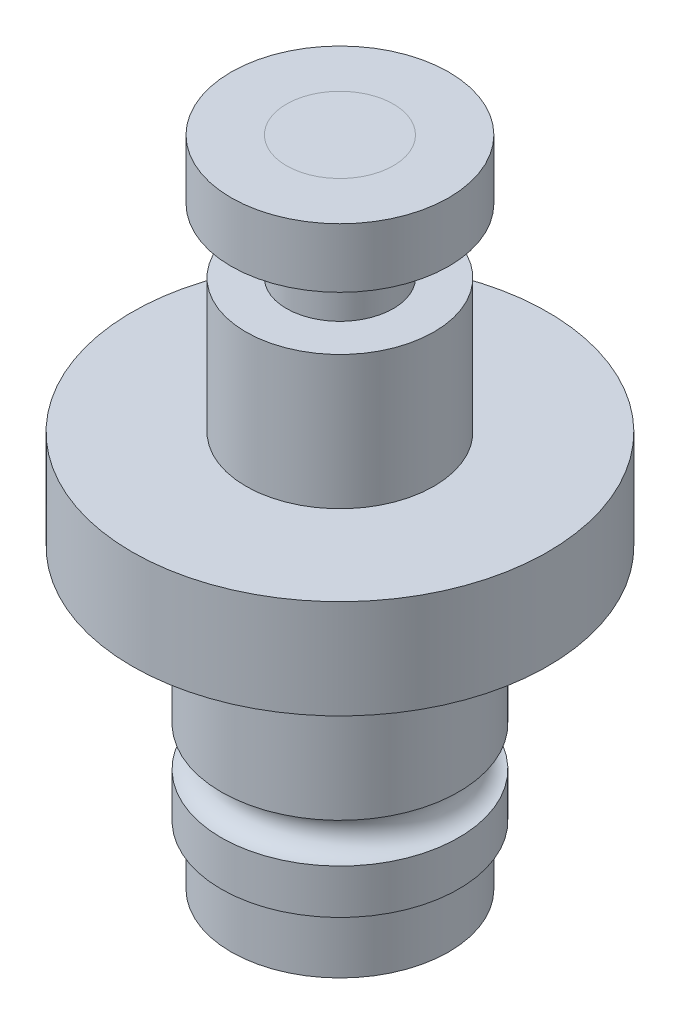
ISO-10303-21;
HEADER;
FILE_DESCRIPTION(('STEP AP214'),'2;1');
FILE_NAME('part.step','',(''),(''),'','','');
FILE_SCHEMA(('AUTOMOTIVE_DESIGN { 1 0 10303 214 1 1 1 1 }'));
ENDSEC;
DATA;
#1=APPLICATION_CONTEXT('core data for automotive mechanical design processes');
#2=APPLICATION_PROTOCOL_DEFINITION('international standard','automotive_design',2000,#1);
#3=PRODUCT_CONTEXT('',#1,'mechanical');
#4=PRODUCT('Part','Part','',(#3));
#5=PRODUCT_RELATED_PRODUCT_CATEGORY('part','',(#4));
#6=PRODUCT_DEFINITION_FORMATION('','',#4);
#7=PRODUCT_DEFINITION_CONTEXT('part definition',#1,'design');
#8=PRODUCT_DEFINITION('design','',#6,#7);
#9=PRODUCT_DEFINITION_SHAPE('','',#8);
#10=(LENGTH_UNIT() NAMED_UNIT(*) SI_UNIT(.MILLI.,.METRE.));
#11=(NAMED_UNIT(*) PLANE_ANGLE_UNIT() SI_UNIT($,.RADIAN.));
#12=(NAMED_UNIT(*) SI_UNIT($,.STERADIAN.) SOLID_ANGLE_UNIT());
#13=UNCERTAINTY_MEASURE_WITH_UNIT(LENGTH_MEASURE(1.E-05),#10,'distance_accuracy_value','');
#14=(GEOMETRIC_REPRESENTATION_CONTEXT(3) GLOBAL_UNCERTAINTY_ASSIGNED_CONTEXT((#13)) GLOBAL_UNIT_ASSIGNED_CONTEXT((#10,
#11,#12)) REPRESENTATION_CONTEXT('',''));
#15=CARTESIAN_POINT('',(0.,0.,0.));
#16=DIRECTION('',(0.,0.,1.));
#17=DIRECTION('',(1.,0.,0.));
#18=AXIS2_PLACEMENT_3D('',#15,#16,#17);
#19=CARTESIAN_POINT('',(0.,-17.5,0.));
#20=DIRECTION('',(0.,-1.,0.));
#21=DIRECTION('',(0.,0.,-1.));
#22=AXIS2_PLACEMENT_3D('',#19,#20,#21);
#23=PLANE('',#22);
#24=CARTESIAN_POINT('',(0.,-17.5,0.));
#25=DIRECTION('',(0.,-1.,0.));
#26=DIRECTION('',(0.,0.,-1.));
#27=AXIS2_PLACEMENT_3D('',#24,#25,#26);
#28=CIRCLE('',#27,5.5);
#29=CARTESIAN_POINT('',(0.,-17.5,-5.5));
#30=VERTEX_POINT('',#29);
#31=EDGE_CURVE('E11',#30,#30,#28,.T.);
#32=ORIENTED_EDGE('',*,*,#31,.T.);
#33=EDGE_LOOP('',(#32));
#34=FACE_BOUND('',#33,.T.);
#35=CARTESIAN_POINT('',(0.,-17.5,0.));
#36=DIRECTION('',(0.,-1.,0.));
#37=DIRECTION('',(0.,0.,-1.));
#38=AXIS2_PLACEMENT_3D('',#35,#36,#37);
#39=CIRCLE('',#38,2.5);
#40=CARTESIAN_POINT('',(0.,-17.5,-2.5));
#41=VERTEX_POINT('',#40);
#42=EDGE_CURVE('E52',#41,#41,#39,.T.);
#43=ORIENTED_EDGE('',*,*,#42,.F.);
#44=EDGE_LOOP('',(#43));
#45=FACE_BOUND('',#44,.T.);
#46=ADVANCED_FACE('F41',(#34,#45),#23,.T.);
#47=CARTESIAN_POINT('',(0.,-14.5,0.));
#48=DIRECTION('',(0.,-1.,0.));
#49=DIRECTION('',(0.,0.,-1.));
#50=AXIS2_PLACEMENT_3D('',#47,#48,#49);
#51=PLANE('',#50);
#52=CARTESIAN_POINT('',(0.,-14.5,0.));
#53=DIRECTION('',(0.,-1.,0.));
#54=DIRECTION('',(0.,0.,-1.));
#55=AXIS2_PLACEMENT_3D('',#52,#53,#54);
#56=CIRCLE('',#55,5.5);
#57=CARTESIAN_POINT('',(0.,-14.5,-5.5));
#58=VERTEX_POINT('',#57);
#59=EDGE_CURVE('E45',#58,#58,#56,.T.);
#60=ORIENTED_EDGE('',*,*,#59,.F.);
#61=EDGE_LOOP('',(#60));
#62=FACE_BOUND('',#61,.T.);
#63=CARTESIAN_POINT('',(0.,-14.5,0.));
#64=DIRECTION('',(0.,-1.,0.));
#65=DIRECTION('',(0.,0.,-1.));
#66=AXIS2_PLACEMENT_3D('',#63,#64,#65);
#67=CIRCLE('',#66,2.5);
#68=CARTESIAN_POINT('',(0.,-14.5,-2.5));
#69=VERTEX_POINT('',#68);
#70=EDGE_CURVE('E54',#69,#69,#67,.T.);
#71=ORIENTED_EDGE('',*,*,#70,.T.);
#72=EDGE_LOOP('',(#71));
#73=FACE_BOUND('',#72,.T.);
#74=ADVANCED_FACE('F64',(#62,#73),#51,.F.);
#75=CARTESIAN_POINT('',(0.,-17.5,0.));
#76=DIRECTION('',(0.,1.,0.));
#77=DIRECTION('',(0.,0.,1.));
#78=AXIS2_PLACEMENT_3D('',#75,#76,#77);
#79=CYLINDRICAL_SURFACE('',#78,5.5);
#80=ORIENTED_EDGE('',*,*,#31,.F.);
#81=EDGE_LOOP('',(#80));
#82=FACE_BOUND('',#81,.T.);
#83=ORIENTED_EDGE('',*,*,#59,.T.);
#84=EDGE_LOOP('',(#83));
#85=FACE_BOUND('',#84,.T.);
#86=ADVANCED_FACE('F43',(#82,#85),#79,.T.);
#87=CARTESIAN_POINT('',(0.,-17.5,0.));
#88=DIRECTION('',(0.,1.,0.));
#89=DIRECTION('',(0.,0.,1.));
#90=AXIS2_PLACEMENT_3D('',#87,#88,#89);
#91=CYLINDRICAL_SURFACE('',#90,2.5);
#92=ORIENTED_EDGE('',*,*,#42,.T.);
#93=EDGE_LOOP('',(#92));
#94=FACE_BOUND('',#93,.T.);
#95=ORIENTED_EDGE('',*,*,#70,.F.);
#96=EDGE_LOOP('',(#95));
#97=FACE_BOUND('',#96,.T.);
#98=ADVANCED_FACE('F60',(#94,#97),#91,.F.);
#99=CLOSED_SHELL('',(#46,#74,#86,#98));
#100=MANIFOLD_SOLID_BREP('B2',#99);
#101=CARTESIAN_POINT('',(0.,-14.5,0.));
#102=DIRECTION('',(0.,1.,0.));
#103=DIRECTION('',(0.,0.,1.));
#104=AXIS2_PLACEMENT_3D('',#101,#102,#103);
#105=CYLINDRICAL_SURFACE('',#104,6.);
#106=CARTESIAN_POINT('',(0.,-12.25,0.));
#107=DIRECTION('',(0.,1.,0.));
#108=DIRECTION('',(0.,0.,1.));
#109=AXIS2_PLACEMENT_3D('',#106,#107,#108);
#110=CIRCLE('',#109,6.);
#111=CARTESIAN_POINT('',(0.,-12.25,6.));
#112=VERTEX_POINT('',#111);
#113=EDGE_CURVE('E114',#112,#112,#110,.F.);
#114=ORIENTED_EDGE('',*,*,#113,.T.);
#115=EDGE_LOOP('',(#114));
#116=FACE_BOUND('',#115,.T.);
#117=CARTESIAN_POINT('',(0.,-14.5,0.));
#118=DIRECTION('',(0.,-1.,0.));
#119=DIRECTION('',(0.,0.,-1.));
#120=AXIS2_PLACEMENT_3D('',#117,#118,#119);
#121=CIRCLE('',#120,6.);
#122=CARTESIAN_POINT('',(0.,-14.5,-6.));
#123=VERTEX_POINT('',#122);
#124=EDGE_CURVE('E40',#123,#123,#121,.T.);
#125=ORIENTED_EDGE('',*,*,#124,.F.);
#126=EDGE_LOOP('',(#125));
#127=FACE_BOUND('',#126,.T.);
#128=ADVANCED_FACE('F110',(#116,#127),#105,.T.);
#129=CARTESIAN_POINT('',(0.,-14.5,0.));
#130=DIRECTION('',(0.,-1.,0.));
#131=DIRECTION('',(0.,0.,-1.));
#132=AXIS2_PLACEMENT_3D('',#129,#130,#131);
#133=PLANE('',#132);
#134=ORIENTED_EDGE('',*,*,#124,.T.);
#135=EDGE_LOOP('',(#134));
#136=FACE_BOUND('',#135,.T.);
#137=CARTESIAN_POINT('',(0.,-14.5,0.));
#138=DIRECTION('',(0.,-1.,0.));
#139=DIRECTION('',(0.,0.,-1.));
#140=AXIS2_PLACEMENT_3D('',#137,#138,#139);
#141=CIRCLE('',#140,2.5);
#142=CARTESIAN_POINT('',(0.,-14.5,-2.5));
#143=VERTEX_POINT('',#142);
#144=EDGE_CURVE('E123',#143,#143,#141,.T.);
#145=ORIENTED_EDGE('',*,*,#144,.F.);
#146=EDGE_LOOP('',(#145));
#147=FACE_BOUND('',#146,.T.);
#148=ADVANCED_FACE('F144',(#136,#147),#133,.T.);
#149=CARTESIAN_POINT('',(0.,-3.5,0.));
#150=DIRECTION('',(0.,-1.,0.));
#151=DIRECTION('',(0.,0.,-1.));
#152=AXIS2_PLACEMENT_3D('',#149,#150,#151);
#153=PLANE('',#152);
#154=CARTESIAN_POINT('',(0.,-3.5,0.));
#155=DIRECTION('',(0.,-1.,0.));
#156=DIRECTION('',(0.,0.,-1.));
#157=AXIS2_PLACEMENT_3D('',#154,#155,#156);
#158=CIRCLE('',#157,6.);
#159=CARTESIAN_POINT('',(0.,-3.5,-6.));
#160=VERTEX_POINT('',#159);
#161=EDGE_CURVE('E118',#160,#160,#158,.T.);
#162=ORIENTED_EDGE('',*,*,#161,.F.);
#163=EDGE_LOOP('',(#162));
#164=FACE_BOUND('',#163,.T.);
#165=CARTESIAN_POINT('',(0.,-3.5,0.));
#166=DIRECTION('',(0.,-1.,0.));
#167=DIRECTION('',(0.,0.,-1.));
#168=AXIS2_PLACEMENT_3D('',#165,#166,#167);
#169=CIRCLE('',#168,2.5);
#170=CARTESIAN_POINT('',(0.,-3.5,-2.5));
#171=VERTEX_POINT('',#170);
#172=EDGE_CURVE('E126',#171,#171,#169,.T.);
#173=ORIENTED_EDGE('',*,*,#172,.T.);
#174=EDGE_LOOP('',(#173));
#175=FACE_BOUND('',#174,.T.);
#176=ADVANCED_FACE('F146',(#164,#175),#153,.F.);
#177=CARTESIAN_POINT('',(0.,-10.25,0.));
#178=DIRECTION('',(0.,-1.,0.));
#179=DIRECTION('',(0.,0.,-1.));
#180=AXIS2_PLACEMENT_3D('',#177,#178,#179);
#181=CIRCLE('',#180,6.);
#182=CARTESIAN_POINT('',(0.,-10.25,-6.));
#183=VERTEX_POINT('',#182);
#184=EDGE_CURVE('E128',#183,#183,#181,.F.);
#185=ORIENTED_EDGE('',*,*,#184,.T.);
#186=EDGE_LOOP('',(#185));
#187=FACE_BOUND('',#186,.T.);
#188=ORIENTED_EDGE('',*,*,#161,.T.);
#189=EDGE_LOOP('',(#188));
#190=FACE_BOUND('',#189,.T.);
#191=ADVANCED_FACE('F112',(#187,#190),#105,.T.);
#192=CARTESIAN_POINT('',(0.,-14.5,0.));
#193=DIRECTION('',(0.,1.,0.));
#194=DIRECTION('',(0.,0.,1.));
#195=AXIS2_PLACEMENT_3D('',#192,#193,#194);
#196=CYLINDRICAL_SURFACE('',#195,2.5);
#197=ORIENTED_EDGE('',*,*,#144,.T.);
#198=EDGE_LOOP('',(#197));
#199=FACE_BOUND('',#198,.T.);
#200=ORIENTED_EDGE('',*,*,#172,.F.);
#201=EDGE_LOOP('',(#200));
#202=FACE_BOUND('',#201,.T.);
#203=ADVANCED_FACE('F141',(#199,#202),#196,.F.);
#204=CARTESIAN_POINT('',(0.,-11.25,0.));
#205=DIRECTION('',(0.,-1.,0.));
#206=DIRECTION('',(0.,0.,-1.));
#207=AXIS2_PLACEMENT_3D('',#204,#205,#206);
#208=TOROIDAL_SURFACE('',#207,6.,1.);
#209=ORIENTED_EDGE('',*,*,#184,.F.);
#210=EDGE_LOOP('',(#209));
#211=FACE_BOUND('',#210,.T.);
#212=ORIENTED_EDGE('',*,*,#113,.F.);
#213=EDGE_LOOP('',(#212));
#214=FACE_BOUND('',#213,.T.);
#215=ADVANCED_FACE('F156',(#211,#214),#208,.F.);
#216=CLOSED_SHELL('',(#128,#148,#176,#191,#203,#215));
#217=MANIFOLD_SOLID_BREP('B6',#216);
#218=CARTESIAN_POINT('',(0.,-3.5,0.));
#219=DIRECTION('',(0.,-1.,0.));
#220=DIRECTION('',(0.,0.,-1.));
#221=AXIS2_PLACEMENT_3D('',#218,#219,#220);
#222=PLANE('',#221);
#223=CARTESIAN_POINT('',(0.,-3.5,0.));
#224=DIRECTION('',(0.,-1.,0.));
#225=DIRECTION('',(0.,0.,-1.));
#226=AXIS2_PLACEMENT_3D('',#223,#224,#225);
#227=CIRCLE('',#226,4.875);
#228=CARTESIAN_POINT('',(0.,-3.5,-4.875));
#229=VERTEX_POINT('',#228);
#230=EDGE_CURVE('E109',#229,#229,#227,.T.);
#231=ORIENTED_EDGE('',*,*,#230,.T.);
#232=EDGE_LOOP('',(#231));
#233=FACE_BOUND('',#232,.T.);
#234=CARTESIAN_POINT('',(0.,-3.5,0.));
#235=DIRECTION('',(0.,-1.,0.));
#236=DIRECTION('',(0.,0.,-1.));
#237=AXIS2_PLACEMENT_3D('',#234,#235,#236);
#238=CIRCLE('',#237,2.5);
#239=CARTESIAN_POINT('',(0.,-3.5,-2.5));
#240=VERTEX_POINT('',#239);
#241=EDGE_CURVE('E238',#240,#240,#238,.T.);
#242=ORIENTED_EDGE('',*,*,#241,.F.);
#243=EDGE_LOOP('',(#242));
#244=FACE_BOUND('',#243,.T.);
#245=ADVANCED_FACE('F227',(#233,#244),#222,.T.);
#246=CARTESIAN_POINT('',(0.,-2.5,0.));
#247=DIRECTION('',(0.,-1.,0.));
#248=DIRECTION('',(0.,0.,-1.));
#249=AXIS2_PLACEMENT_3D('',#246,#247,#248);
#250=PLANE('',#249);
#251=CARTESIAN_POINT('',(0.,-2.5,0.));
#252=DIRECTION('',(0.,-1.,0.));
#253=DIRECTION('',(0.,0.,-1.));
#254=AXIS2_PLACEMENT_3D('',#251,#252,#253);
#255=CIRCLE('',#254,4.875);
#256=CARTESIAN_POINT('',(0.,-2.5,-4.875));
#257=VERTEX_POINT('',#256);
#258=EDGE_CURVE('E231',#257,#257,#255,.T.);
#259=ORIENTED_EDGE('',*,*,#258,.F.);
#260=EDGE_LOOP('',(#259));
#261=FACE_BOUND('',#260,.T.);
#262=CARTESIAN_POINT('',(0.,-2.5,0.));
#263=DIRECTION('',(0.,-1.,0.));
#264=DIRECTION('',(0.,0.,-1.));
#265=AXIS2_PLACEMENT_3D('',#262,#263,#264);
#266=CIRCLE('',#265,2.5);
#267=CARTESIAN_POINT('',(0.,-2.5,-2.5));
#268=VERTEX_POINT('',#267);
#269=EDGE_CURVE('E240',#268,#268,#266,.T.);
#270=ORIENTED_EDGE('',*,*,#269,.T.);
#271=EDGE_LOOP('',(#270));
#272=FACE_BOUND('',#271,.T.);
#273=ADVANCED_FACE('F250',(#261,#272),#250,.F.);
#274=CARTESIAN_POINT('',(0.,-3.5,0.));
#275=DIRECTION('',(0.,1.,0.));
#276=DIRECTION('',(0.,0.,1.));
#277=AXIS2_PLACEMENT_3D('',#274,#275,#276);
#278=CYLINDRICAL_SURFACE('',#277,4.875);
#279=ORIENTED_EDGE('',*,*,#230,.F.);
#280=EDGE_LOOP('',(#279));
#281=FACE_BOUND('',#280,.T.);
#282=ORIENTED_EDGE('',*,*,#258,.T.);
#283=EDGE_LOOP('',(#282));
#284=FACE_BOUND('',#283,.T.);
#285=ADVANCED_FACE('F229',(#281,#284),#278,.T.);
#286=CARTESIAN_POINT('',(0.,-3.5,0.));
#287=DIRECTION('',(0.,1.,0.));
#288=DIRECTION('',(0.,0.,1.));
#289=AXIS2_PLACEMENT_3D('',#286,#287,#288);
#290=CYLINDRICAL_SURFACE('',#289,2.5);
#291=ORIENTED_EDGE('',*,*,#241,.T.);
#292=EDGE_LOOP('',(#291));
#293=FACE_BOUND('',#292,.T.);
#294=ORIENTED_EDGE('',*,*,#269,.F.);
#295=EDGE_LOOP('',(#294));
#296=FACE_BOUND('',#295,.T.);
#297=ADVANCED_FACE('F246',(#293,#296),#290,.F.);
#298=CLOSED_SHELL('',(#245,#273,#285,#297));
#299=MANIFOLD_SOLID_BREP('B35',#298);
#300=CARTESIAN_POINT('',(0.,-17.5,0.));
#301=DIRECTION('',(0.,1.,0.));
#302=DIRECTION('',(0.,0.,1.));
#303=AXIS2_PLACEMENT_3D('',#300,#301,#302);
#304=CYLINDRICAL_SURFACE('',#303,2.5);
#305=CARTESIAN_POINT('',(0.,-17.5,0.));
#306=DIRECTION('',(0.,-1.,0.));
#307=DIRECTION('',(0.,0.,-1.));
#308=AXIS2_PLACEMENT_3D('',#305,#306,#307);
#309=CIRCLE('',#308,2.5);
#310=CARTESIAN_POINT('',(0.,-17.5,-2.5));
#311=VERTEX_POINT('',#310);
#312=EDGE_CURVE('E226',#311,#311,#309,.T.);
#313=ORIENTED_EDGE('',*,*,#312,.F.);
#314=EDGE_LOOP('',(#313));
#315=FACE_BOUND('',#314,.T.);
#316=CARTESIAN_POINT('',(0.,-2.5,0.));
#317=DIRECTION('',(0.,-1.,0.));
#318=DIRECTION('',(0.,0.,-1.));
#319=AXIS2_PLACEMENT_3D('',#316,#317,#318);
#320=CIRCLE('',#319,2.5);
#321=CARTESIAN_POINT('',(0.,-2.5,-2.5));
#322=VERTEX_POINT('',#321);
#323=EDGE_CURVE('E312',#322,#322,#320,.T.);
#324=ORIENTED_EDGE('',*,*,#323,.T.);
#325=EDGE_LOOP('',(#324));
#326=FACE_BOUND('',#325,.T.);
#327=ADVANCED_FACE('F309',(#315,#326),#304,.T.);
#328=CARTESIAN_POINT('',(0.,-17.5,0.));
#329=DIRECTION('',(0.,-1.,0.));
#330=DIRECTION('',(0.,0.,-1.));
#331=AXIS2_PLACEMENT_3D('',#328,#329,#330);
#332=PLANE('',#331);
#333=ORIENTED_EDGE('',*,*,#312,.T.);
#334=EDGE_LOOP('',(#333));
#335=FACE_BOUND('',#334,.T.);
#336=ADVANCED_FACE('F324',(#335),#332,.T.);
#337=CARTESIAN_POINT('',(0.,-2.5,0.));
#338=DIRECTION('',(0.,-1.,0.));
#339=DIRECTION('',(0.,0.,-1.));
#340=AXIS2_PLACEMENT_3D('',#337,#338,#339);
#341=PLANE('',#340);
#342=ORIENTED_EDGE('',*,*,#323,.F.);
#343=EDGE_LOOP('',(#342));
#344=FACE_BOUND('',#343,.T.);
#345=ADVANCED_FACE('F322',(#344),#341,.F.);
#346=CLOSED_SHELL('',(#327,#336,#345));
#347=MANIFOLD_SOLID_BREP('B104',#346);
#348=CARTESIAN_POINT('',(0.,12.5,0.));
#349=DIRECTION('',(0.,1.,0.));
#350=DIRECTION('',(0.,0.,1.));
#351=AXIS2_PLACEMENT_3D('',#348,#349,#350);
#352=CYLINDRICAL_SURFACE('',#351,5.5);
#353=CARTESIAN_POINT('',(0.,12.5,0.));
#354=DIRECTION('',(0.,1.,0.));
#355=DIRECTION('',(0.,0.,1.));
#356=AXIS2_PLACEMENT_3D('',#353,#354,#355);
#357=CIRCLE('',#356,5.5);
#358=CARTESIAN_POINT('',(0.,12.5,5.5));
#359=VERTEX_POINT('',#358);
#360=EDGE_CURVE('E308',#359,#359,#357,.T.);
#361=ORIENTED_EDGE('',*,*,#360,.T.);
#362=EDGE_LOOP('',(#361));
#363=FACE_BOUND('',#362,.T.);
#364=CARTESIAN_POINT('',(0.,15.5,0.));
#365=DIRECTION('',(0.,1.,0.));
#366=DIRECTION('',(0.,0.,1.));
#367=AXIS2_PLACEMENT_3D('',#364,#365,#366);
#368=CIRCLE('',#367,5.5);
#369=CARTESIAN_POINT('',(0.,15.5,5.5));
#370=VERTEX_POINT('',#369);
#371=EDGE_CURVE('E372',#370,#370,#368,.T.);
#372=ORIENTED_EDGE('',*,*,#371,.F.);
#373=EDGE_LOOP('',(#372));
#374=FACE_BOUND('',#373,.T.);
#375=ADVANCED_FACE('F369',(#363,#374),#352,.T.);
#376=CARTESIAN_POINT('',(0.,12.5,0.));
#377=DIRECTION('',(0.,1.,0.));
#378=DIRECTION('',(0.,0.,1.));
#379=AXIS2_PLACEMENT_3D('',#376,#377,#378);
#380=PLANE('',#379);
#381=CARTESIAN_POINT('',(0.,12.5,0.));
#382=DIRECTION('',(0.,1.,0.));
#383=DIRECTION('',(0.,0.,1.));
#384=AXIS2_PLACEMENT_3D('',#381,#382,#383);
#385=CIRCLE('',#384,2.7);
#386=CARTESIAN_POINT('',(0.,12.5,2.7));
#387=VERTEX_POINT('',#386);
#388=EDGE_CURVE('E379',#387,#387,#385,.T.);
#389=ORIENTED_EDGE('',*,*,#388,.T.);
#390=EDGE_LOOP('',(#389));
#391=FACE_BOUND('',#390,.T.);
#392=ORIENTED_EDGE('',*,*,#360,.F.);
#393=EDGE_LOOP('',(#392));
#394=FACE_BOUND('',#393,.T.);
#395=ADVANCED_FACE('F387',(#391,#394),#380,.F.);
#396=CARTESIAN_POINT('',(0.,15.5,0.));
#397=DIRECTION('',(0.,1.,0.));
#398=DIRECTION('',(0.,0.,1.));
#399=AXIS2_PLACEMENT_3D('',#396,#397,#398);
#400=PLANE('',#399);
#401=CARTESIAN_POINT('',(0.,15.5,0.));
#402=DIRECTION('',(0.,1.,0.));
#403=DIRECTION('',(0.,0.,1.));
#404=AXIS2_PLACEMENT_3D('',#401,#402,#403);
#405=CIRCLE('',#404,2.7);
#406=CARTESIAN_POINT('',(0.,15.5,2.7));
#407=VERTEX_POINT('',#406);
#408=EDGE_CURVE('E381',#407,#407,#405,.T.);
#409=ORIENTED_EDGE('',*,*,#408,.F.);
#410=EDGE_LOOP('',(#409));
#411=FACE_BOUND('',#410,.T.);
#412=ORIENTED_EDGE('',*,*,#371,.T.);
#413=EDGE_LOOP('',(#412));
#414=FACE_BOUND('',#413,.T.);
#415=ADVANCED_FACE('F393',(#411,#414),#400,.T.);
#416=CARTESIAN_POINT('',(0.,12.5,0.));
#417=DIRECTION('',(0.,1.,0.));
#418=DIRECTION('',(0.,0.,1.));
#419=AXIS2_PLACEMENT_3D('',#416,#417,#418);
#420=CYLINDRICAL_SURFACE('',#419,2.7);
#421=ORIENTED_EDGE('',*,*,#388,.F.);
#422=EDGE_LOOP('',(#421));
#423=FACE_BOUND('',#422,.T.);
#424=ORIENTED_EDGE('',*,*,#408,.T.);
#425=EDGE_LOOP('',(#424));
#426=FACE_BOUND('',#425,.T.);
#427=ADVANCED_FACE('F390',(#423,#426),#420,.F.);
#428=CLOSED_SHELL('',(#375,#395,#415,#427));
#429=MANIFOLD_SOLID_BREP('B221',#428);
#430=CARTESIAN_POINT('',(0.,-2.5,0.));
#431=DIRECTION('',(0.,1.,0.));
#432=DIRECTION('',(0.,0.,1.));
#433=AXIS2_PLACEMENT_3D('',#430,#431,#432);
#434=CYLINDRICAL_SURFACE('',#433,10.5);
#435=CARTESIAN_POINT('',(0.,-2.5,0.));
#436=DIRECTION('',(0.,1.,0.));
#437=DIRECTION('',(0.,0.,1.));
#438=AXIS2_PLACEMENT_3D('',#435,#436,#437);
#439=CIRCLE('',#438,10.5);
#440=CARTESIAN_POINT('',(0.,-2.5,10.5));
#441=VERTEX_POINT('',#440);
#442=EDGE_CURVE('E368',#441,#441,#439,.T.);
#443=ORIENTED_EDGE('',*,*,#442,.T.);
#444=EDGE_LOOP('',(#443));
#445=FACE_BOUND('',#444,.T.);
#446=CARTESIAN_POINT('',(0.,2.5,0.));
#447=DIRECTION('',(0.,1.,0.));
#448=DIRECTION('',(0.,0.,1.));
#449=AXIS2_PLACEMENT_3D('',#446,#447,#448);
#450=CIRCLE('',#449,10.5);
#451=CARTESIAN_POINT('',(0.,2.5,10.5));
#452=VERTEX_POINT('',#451);
#453=EDGE_CURVE('E453',#452,#452,#450,.T.);
#454=ORIENTED_EDGE('',*,*,#453,.F.);
#455=EDGE_LOOP('',(#454));
#456=FACE_BOUND('',#455,.T.);
#457=ADVANCED_FACE('F447',(#445,#456),#434,.T.);
#458=CARTESIAN_POINT('',(0.,-2.5,0.));
#459=DIRECTION('',(0.,1.,0.));
#460=DIRECTION('',(0.,0.,1.));
#461=AXIS2_PLACEMENT_3D('',#458,#459,#460);
#462=PLANE('',#461);
#463=ORIENTED_EDGE('',*,*,#442,.F.);
#464=EDGE_LOOP('',(#463));
#465=FACE_BOUND('',#464,.T.);
#466=ADVANCED_FACE('F495',(#465),#462,.F.);
#467=CARTESIAN_POINT('',(0.,2.5,0.));
#468=DIRECTION('',(0.,1.,0.));
#469=DIRECTION('',(0.,0.,1.));
#470=AXIS2_PLACEMENT_3D('',#467,#468,#469);
#471=PLANE('',#470);
#472=CARTESIAN_POINT('',(0.,2.5,0.));
#473=DIRECTION('',(0.,1.,0.));
#474=DIRECTION('',(0.,0.,1.));
#475=AXIS2_PLACEMENT_3D('',#472,#473,#474);
#476=CIRCLE('',#475,4.75);
#477=CARTESIAN_POINT('',(0.,2.5,4.75));
#478=VERTEX_POINT('',#477);
#479=EDGE_CURVE('E461',#478,#478,#476,.T.);
#480=ORIENTED_EDGE('',*,*,#479,.F.);
#481=EDGE_LOOP('',(#480));
#482=FACE_BOUND('',#481,.T.);
#483=ORIENTED_EDGE('',*,*,#453,.T.);
#484=EDGE_LOOP('',(#483));
#485=FACE_BOUND('',#484,.T.);
#486=ADVANCED_FACE('F490',(#482,#485),#471,.T.);
#487=CARTESIAN_POINT('',(0.,9.25,0.));
#488=DIRECTION('',(0.,-1.,0.));
#489=DIRECTION('',(0.,0.,-1.));
#490=AXIS2_PLACEMENT_3D('',#487,#488,#489);
#491=CYLINDRICAL_SURFACE('',#490,4.75);
#492=CARTESIAN_POINT('',(0.,9.25,0.));
#493=DIRECTION('',(0.,1.,0.));
#494=DIRECTION('',(0.,0.,1.));
#495=AXIS2_PLACEMENT_3D('',#492,#493,#494);
#496=CIRCLE('',#495,4.75);
#497=CARTESIAN_POINT('',(0.,9.25,4.75));
#498=VERTEX_POINT('',#497);
#499=EDGE_CURVE('E457',#498,#498,#496,.T.);
#500=ORIENTED_EDGE('',*,*,#499,.F.);
#501=EDGE_LOOP('',(#500));
#502=FACE_BOUND('',#501,.T.);
#503=ORIENTED_EDGE('',*,*,#479,.T.);
#504=EDGE_LOOP('',(#503));
#505=FACE_BOUND('',#504,.T.);
#506=ADVANCED_FACE('F484',(#502,#505),#491,.T.);
#507=CARTESIAN_POINT('',(0.,9.25,0.));
#508=DIRECTION('',(0.,1.,0.));
#509=DIRECTION('',(0.,0.,1.));
#510=AXIS2_PLACEMENT_3D('',#507,#508,#509);
#511=PLANE('',#510);
#512=CARTESIAN_POINT('',(0.,9.25,0.));
#513=DIRECTION('',(0.,1.,0.));
#514=DIRECTION('',(0.,0.,1.));
#515=AXIS2_PLACEMENT_3D('',#512,#513,#514);
#516=CIRCLE('',#515,2.7);
#517=CARTESIAN_POINT('',(0.,9.25,2.7));
#518=VERTEX_POINT('',#517);
#519=EDGE_CURVE('E467',#518,#518,#516,.T.);
#520=ORIENTED_EDGE('',*,*,#519,.F.);
#521=EDGE_LOOP('',(#520));
#522=FACE_BOUND('',#521,.T.);
#523=ORIENTED_EDGE('',*,*,#499,.T.);
#524=EDGE_LOOP('',(#523));
#525=FACE_BOUND('',#524,.T.);
#526=ADVANCED_FACE('F478',(#522,#525),#511,.T.);
#527=CARTESIAN_POINT('',(0.,15.5,0.));
#528=DIRECTION('',(0.,-1.,0.));
#529=DIRECTION('',(0.,0.,-1.));
#530=AXIS2_PLACEMENT_3D('',#527,#528,#529);
#531=CYLINDRICAL_SURFACE('',#530,2.7);
#532=CARTESIAN_POINT('',(0.,15.5,0.));
#533=DIRECTION('',(0.,1.,0.));
#534=DIRECTION('',(0.,0.,1.));
#535=AXIS2_PLACEMENT_3D('',#532,#533,#534);
#536=CIRCLE('',#535,2.7);
#537=CARTESIAN_POINT('',(0.,15.5,2.7));
#538=VERTEX_POINT('',#537);
#539=EDGE_CURVE('E465',#538,#538,#536,.T.);
#540=ORIENTED_EDGE('',*,*,#539,.F.);
#541=EDGE_LOOP('',(#540));
#542=FACE_BOUND('',#541,.T.);
#543=ORIENTED_EDGE('',*,*,#519,.T.);
#544=EDGE_LOOP('',(#543));
#545=FACE_BOUND('',#544,.T.);
#546=ADVANCED_FACE('F475',(#542,#545),#531,.T.);
#547=CARTESIAN_POINT('',(0.,15.5,0.));
#548=DIRECTION('',(0.,1.,0.));
#549=DIRECTION('',(0.,0.,1.));
#550=AXIS2_PLACEMENT_3D('',#547,#548,#549);
#551=PLANE('',#550);
#552=ORIENTED_EDGE('',*,*,#539,.T.);
#553=EDGE_LOOP('',(#552));
#554=FACE_BOUND('',#553,.T.);
#555=ADVANCED_FACE('F473',(#554),#551,.T.);
#556=CLOSED_SHELL('',(#457,#466,#486,#506,#526,#546,#555));
#557=MANIFOLD_SOLID_BREP('B303',#556);
#558=ADVANCED_BREP_SHAPE_REPRESENTATION('',(#18,#100,#217,#299,#347,#429,#557),#14);
#559=SHAPE_DEFINITION_REPRESENTATION(#9,#558);
ENDSEC;
END-ISO-10303-21;
